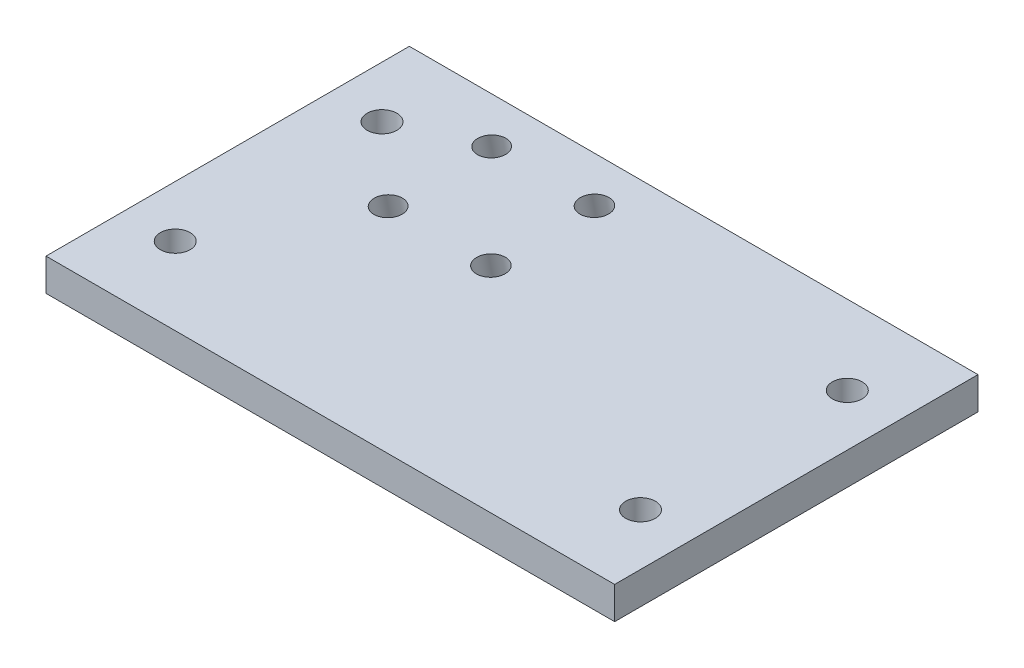
ISO-10303-21;
HEADER;
FILE_DESCRIPTION(('STEP AP214'),'2;1');
FILE_NAME('part.step','',(''),(''),'','','');
FILE_SCHEMA(('AUTOMOTIVE_DESIGN { 1 0 10303 214 1 1 1 1 }'));
ENDSEC;
DATA;
#1=APPLICATION_CONTEXT('core data for automotive mechanical design processes');
#2=APPLICATION_PROTOCOL_DEFINITION('international standard','automotive_design',2000,#1);
#3=PRODUCT_CONTEXT('',#1,'mechanical');
#4=PRODUCT('Part','Part','',(#3));
#5=PRODUCT_RELATED_PRODUCT_CATEGORY('part','',(#4));
#6=PRODUCT_DEFINITION_FORMATION('','',#4);
#7=PRODUCT_DEFINITION_CONTEXT('part definition',#1,'design');
#8=PRODUCT_DEFINITION('design','',#6,#7);
#9=PRODUCT_DEFINITION_SHAPE('','',#8);
#10=(LENGTH_UNIT() NAMED_UNIT(*) SI_UNIT(.MILLI.,.METRE.));
#11=(NAMED_UNIT(*) PLANE_ANGLE_UNIT() SI_UNIT($,.RADIAN.));
#12=(NAMED_UNIT(*) SI_UNIT($,.STERADIAN.) SOLID_ANGLE_UNIT());
#13=UNCERTAINTY_MEASURE_WITH_UNIT(LENGTH_MEASURE(1.E-05),#10,'distance_accuracy_value','');
#14=(GEOMETRIC_REPRESENTATION_CONTEXT(3) GLOBAL_UNCERTAINTY_ASSIGNED_CONTEXT((#13)) GLOBAL_UNIT_ASSIGNED_CONTEXT((#10,
#11,#12)) REPRESENTATION_CONTEXT('',''));
#15=CARTESIAN_POINT('',(0.,0.,0.));
#16=DIRECTION('',(0.,0.,1.));
#17=DIRECTION('',(1.,0.,0.));
#18=AXIS2_PLACEMENT_3D('',#15,#16,#17);
#19=CARTESIAN_POINT('',(0.,5.,0.));
#20=DIRECTION('',(0.,0.,-1.));
#21=DIRECTION('',(-1.,0.,0.));
#22=AXIS2_PLACEMENT_3D('',#19,#20,#21);
#23=PLANE('',#22);
#24=DIRECTION('',(1.,0.,0.));
#25=VECTOR('',#24,1.);
#26=CARTESIAN_POINT('',(0.,5.,0.));
#27=LINE('',#26,#25);
#28=CARTESIAN_POINT('',(2.,5.,0.));
#29=VERTEX_POINT('',#28);
#30=CARTESIAN_POINT('',(90.,5.,0.));
#31=VERTEX_POINT('',#30);
#32=EDGE_CURVE('E89',#29,#31,#27,.T.);
#33=ORIENTED_EDGE('',*,*,#32,.F.);
#34=DIRECTION('',(0.,-1.,0.));
#35=VECTOR('',#34,1.);
#36=CARTESIAN_POINT('',(2.,5.,0.));
#37=LINE('',#36,#35);
#38=CARTESIAN_POINT('',(2.,0.,0.));
#39=VERTEX_POINT('',#38);
#40=EDGE_CURVE('E137',#29,#39,#37,.T.);
#41=ORIENTED_EDGE('',*,*,#40,.T.);
#42=DIRECTION('',(1.,0.,0.));
#43=VECTOR('',#42,1.);
#44=CARTESIAN_POINT('',(0.,0.,0.));
#45=LINE('',#44,#43);
#46=CARTESIAN_POINT('',(90.,0.,0.));
#47=VERTEX_POINT('',#46);
#48=EDGE_CURVE('E79',#39,#47,#45,.T.);
#49=ORIENTED_EDGE('',*,*,#48,.T.);
#50=DIRECTION('',(0.,-1.,0.));
#51=VECTOR('',#50,1.);
#52=CARTESIAN_POINT('',(90.,5.,0.));
#53=LINE('',#52,#51);
#54=EDGE_CURVE('E11',#31,#47,#53,.T.);
#55=ORIENTED_EDGE('',*,*,#54,.F.);
#56=EDGE_LOOP('',(#33,#41,#49,#55));
#57=FACE_BOUND('',#56,.T.);
#58=ADVANCED_FACE('F33',(#57),#23,.F.);
#59=CARTESIAN_POINT('',(90.,5.,0.));
#60=DIRECTION('',(-1.,0.,0.));
#61=DIRECTION('',(0.,0.,1.));
#62=AXIS2_PLACEMENT_3D('',#59,#60,#61);
#63=PLANE('',#62);
#64=DIRECTION('',(0.,0.,-1.));
#65=VECTOR('',#64,1.);
#66=CARTESIAN_POINT('',(90.,0.,0.));
#67=LINE('',#66,#65);
#68=CARTESIAN_POINT('',(90.,0.,-56.23));
#69=VERTEX_POINT('',#68);
#70=EDGE_CURVE('E70',#47,#69,#67,.T.);
#71=ORIENTED_EDGE('',*,*,#70,.T.);
#72=DIRECTION('',(0.,-1.,0.));
#73=VECTOR('',#72,1.);
#74=CARTESIAN_POINT('',(90.,5.,-56.23));
#75=LINE('',#74,#73);
#76=CARTESIAN_POINT('',(90.,5.,-56.23));
#77=VERTEX_POINT('',#76);
#78=EDGE_CURVE('E41',#77,#69,#75,.T.);
#79=ORIENTED_EDGE('',*,*,#78,.F.);
#80=DIRECTION('',(0.,0.,-1.));
#81=VECTOR('',#80,1.);
#82=CARTESIAN_POINT('',(90.,5.,0.));
#83=LINE('',#82,#81);
#84=EDGE_CURVE('E58',#31,#77,#83,.T.);
#85=ORIENTED_EDGE('',*,*,#84,.F.);
#86=ORIENTED_EDGE('',*,*,#54,.T.);
#87=EDGE_LOOP('',(#71,#79,#85,#86));
#88=FACE_BOUND('',#87,.T.);
#89=ADVANCED_FACE('F72',(#88),#63,.F.);
#90=CARTESIAN_POINT('',(0.,5.,-56.23));
#91=DIRECTION('',(0.,0.,1.));
#92=DIRECTION('',(1.,0.,0.));
#93=AXIS2_PLACEMENT_3D('',#90,#91,#92);
#94=PLANE('',#93);
#95=DIRECTION('',(-1.,0.,0.));
#96=VECTOR('',#95,1.);
#97=CARTESIAN_POINT('',(0.,0.,-56.23));
#98=LINE('',#97,#96);
#99=CARTESIAN_POINT('',(1.99999999999999,0.,-56.23));
#100=VERTEX_POINT('',#99);
#101=EDGE_CURVE('E78',#69,#100,#98,.T.);
#102=ORIENTED_EDGE('',*,*,#101,.T.);
#103=DIRECTION('',(0.,-1.,0.));
#104=VECTOR('',#103,1.);
#105=CARTESIAN_POINT('',(1.99999999999997,0.,-56.23));
#106=LINE('',#105,#104);
#107=CARTESIAN_POINT('',(1.99999999999997,5.,-56.23));
#108=VERTEX_POINT('',#107);
#109=EDGE_CURVE('E49',#108,#100,#106,.T.);
#110=ORIENTED_EDGE('',*,*,#109,.F.);
#111=DIRECTION('',(-1.,0.,0.));
#112=VECTOR('',#111,1.);
#113=CARTESIAN_POINT('',(0.,5.,-56.23));
#114=LINE('',#113,#112);
#115=EDGE_CURVE('E84',#77,#108,#114,.T.);
#116=ORIENTED_EDGE('',*,*,#115,.F.);
#117=ORIENTED_EDGE('',*,*,#78,.T.);
#118=EDGE_LOOP('',(#102,#110,#116,#117));
#119=FACE_BOUND('',#118,.T.);
#120=ADVANCED_FACE('F83',(#119),#94,.F.);
#121=CARTESIAN_POINT('',(0.,5.,0.));
#122=DIRECTION('',(0.,-1.,0.));
#123=DIRECTION('',(0.,0.,-1.));
#124=AXIS2_PLACEMENT_3D('',#121,#122,#123);
#125=PLANE('',#124);
#126=CARTESIAN_POINT('',(21.7903171823512,5.,-33.1540398559662));
#127=DIRECTION('',(0.,-1.,0.));
#128=DIRECTION('',(0.,0.,1.));
#129=AXIS2_PLACEMENT_3D('',#126,#127,#128);
#130=ELLIPSE('',#129,2.2,2.15957980358486);
#131=CARTESIAN_POINT('',(21.7903171823512,5.,-30.9540398559662));
#132=VERTEX_POINT('',#131);
#133=EDGE_CURVE('E129',#132,#132,#130,.T.);
#134=ORIENTED_EDGE('',*,*,#133,.T.);
#135=EDGE_LOOP('',(#134));
#136=FACE_BOUND('',#135,.T.);
#137=CARTESIAN_POINT('',(37.700491287554,5.,-33.1540398559662));
#138=DIRECTION('',(0.,-1.,0.));
#139=DIRECTION('',(0.,0.,1.));
#140=AXIS2_PLACEMENT_3D('',#137,#138,#139);
#141=ELLIPSE('',#140,2.24132498514727,2.200145532361);
#142=CARTESIAN_POINT('',(37.700491287554,5.,-30.912714870819));
#143=VERTEX_POINT('',#142);
#144=EDGE_CURVE('E118',#143,#143,#141,.T.);
#145=ORIENTED_EDGE('',*,*,#144,.T.);
#146=EDGE_LOOP('',(#145));
#147=FACE_BOUND('',#146,.T.);
#148=CARTESIAN_POINT('',(37.700491287554,5.,-49.1767660082383));
#149=DIRECTION('',(0.,-1.,0.));
#150=DIRECTION('',(0.,0.,1.));
#151=AXIS2_PLACEMENT_3D('',#148,#149,#150);
#152=ELLIPSE('',#151,2.24117672890147,2.2);
#153=CARTESIAN_POINT('',(37.700491287554,5.,-46.9355892793368));
#154=VERTEX_POINT('',#153);
#155=EDGE_CURVE('E115',#154,#154,#152,.T.);
#156=ORIENTED_EDGE('',*,*,#155,.T.);
#157=EDGE_LOOP('',(#156));
#158=FACE_BOUND('',#157,.T.);
#159=CARTESIAN_POINT('',(21.7903171823512,5.,-49.1767660082383));
#160=DIRECTION('',(0.,-1.,0.));
#161=DIRECTION('',(0.,0.,1.));
#162=AXIS2_PLACEMENT_3D('',#159,#160,#161);
#163=ELLIPSE('',#162,2.2,2.15957980358486);
#164=CARTESIAN_POINT('',(21.7903171823512,5.,-46.9767660082383));
#165=VERTEX_POINT('',#164);
#166=EDGE_CURVE('E112',#165,#165,#163,.T.);
#167=ORIENTED_EDGE('',*,*,#166,.T.);
#168=EDGE_LOOP('',(#167));
#169=FACE_BOUND('',#168,.T.);
#170=CARTESIAN_POINT('',(82.0000000000024,5.,-44.0000000000011));
#171=DIRECTION('',(0.,1.,0.));
#172=DIRECTION('',(0.,0.,1.));
#173=AXIS2_PLACEMENT_3D('',#170,#171,#172);
#174=CIRCLE('',#173,2.29999999999999);
#175=CARTESIAN_POINT('',(82.0000000000024,5.,-41.7000000000011));
#176=VERTEX_POINT('',#175);
#177=EDGE_CURVE('E105',#176,#176,#174,.T.);
#178=ORIENTED_EDGE('',*,*,#177,.F.);
#179=EDGE_LOOP('',(#178));
#180=FACE_BOUND('',#179,.T.);
#181=CARTESIAN_POINT('',(10.0000000000024,5.,-44.0000000000013));
#182=DIRECTION('',(0.,1.,0.));
#183=DIRECTION('',(0.,0.,1.));
#184=AXIS2_PLACEMENT_3D('',#181,#182,#183);
#185=CIRCLE('',#184,2.3);
#186=CARTESIAN_POINT('',(10.0000000000024,5.,-41.7000000000013));
#187=VERTEX_POINT('',#186);
#188=EDGE_CURVE('E140',#187,#187,#185,.T.);
#189=ORIENTED_EDGE('',*,*,#188,.F.);
#190=EDGE_LOOP('',(#189));
#191=FACE_BOUND('',#190,.T.);
#192=CARTESIAN_POINT('',(82.0000000000023,5.,-12.0000000000011));
#193=DIRECTION('',(0.,1.,0.));
#194=DIRECTION('',(0.,0.,1.));
#195=AXIS2_PLACEMENT_3D('',#192,#193,#194);
#196=CIRCLE('',#195,2.29999999999999);
#197=CARTESIAN_POINT('',(82.0000000000023,5.,-9.70000000000109));
#198=VERTEX_POINT('',#197);
#199=EDGE_CURVE('E98',#198,#198,#196,.T.);
#200=ORIENTED_EDGE('',*,*,#199,.F.);
#201=EDGE_LOOP('',(#200));
#202=FACE_BOUND('',#201,.T.);
#203=CARTESIAN_POINT('',(10.0000000000023,5.,-12.0000000000013));
#204=DIRECTION('',(0.,1.,0.));
#205=DIRECTION('',(0.,0.,1.));
#206=AXIS2_PLACEMENT_3D('',#203,#204,#205);
#207=CIRCLE('',#206,2.3);
#208=CARTESIAN_POINT('',(10.0000000000023,5.,-9.70000000000134));
#209=VERTEX_POINT('',#208);
#210=EDGE_CURVE('E108',#209,#209,#207,.T.);
#211=ORIENTED_EDGE('',*,*,#210,.F.);
#212=EDGE_LOOP('',(#211));
#213=FACE_BOUND('',#212,.T.);
#214=ORIENTED_EDGE('',*,*,#115,.T.);
#215=DIRECTION('',(0.,0.,1.));
#216=VECTOR('',#215,1.);
#217=CARTESIAN_POINT('',(2.,5.,0.));
#218=LINE('',#217,#216);
#219=EDGE_CURVE('E134',#108,#29,#218,.T.);
#220=ORIENTED_EDGE('',*,*,#219,.T.);
#221=ORIENTED_EDGE('',*,*,#32,.T.);
#222=ORIENTED_EDGE('',*,*,#84,.T.);
#223=EDGE_LOOP('',(#214,#220,#221,#222));
#224=FACE_BOUND('',#223,.T.);
#225=ADVANCED_FACE('F158',(#136,#147,#158,#169,#180,#191,#202,#213,#224),#125,.F.);
#226=CARTESIAN_POINT('',(0.,0.,0.));
#227=DIRECTION('',(0.,-1.,0.));
#228=DIRECTION('',(0.,0.,-1.));
#229=AXIS2_PLACEMENT_3D('',#226,#227,#228);
#230=PLANE('',#229);
#231=CARTESIAN_POINT('',(21.7903171823512,0.,-34.1259414016548));
#232=DIRECTION('',(0.,-1.,0.));
#233=DIRECTION('',(0.,0.,1.));
#234=AXIS2_PLACEMENT_3D('',#231,#232,#233);
#235=ELLIPSE('',#234,2.2,2.15957980358486);
#236=CARTESIAN_POINT('',(21.7903171823512,0.,-31.9259414016548));
#237=VERTEX_POINT('',#236);
#238=EDGE_CURVE('E36',#237,#237,#235,.T.);
#239=ORIENTED_EDGE('',*,*,#238,.F.);
#240=EDGE_LOOP('',(#239));
#241=FACE_BOUND('',#240,.T.);
#242=CARTESIAN_POINT('',(37.700491287554,0.,-34.1259414016548));
#243=DIRECTION('',(0.,-1.,0.));
#244=DIRECTION('',(0.,0.,1.));
#245=AXIS2_PLACEMENT_3D('',#242,#243,#244);
#246=ELLIPSE('',#245,2.24132498514727,2.200145532361);
#247=CARTESIAN_POINT('',(37.700491287554,0.,-31.8846164165076));
#248=VERTEX_POINT('',#247);
#249=EDGE_CURVE('E116',#248,#248,#246,.T.);
#250=ORIENTED_EDGE('',*,*,#249,.F.);
#251=EDGE_LOOP('',(#250));
#252=FACE_BOUND('',#251,.T.);
#253=CARTESIAN_POINT('',(37.700491287554,0.,-50.1486675539269));
#254=DIRECTION('',(0.,-1.,0.));
#255=DIRECTION('',(0.,0.,1.));
#256=AXIS2_PLACEMENT_3D('',#253,#254,#255);
#257=ELLIPSE('',#256,2.24117672890147,2.2);
#258=CARTESIAN_POINT('',(37.700491287554,0.,-47.9074908250254));
#259=VERTEX_POINT('',#258);
#260=EDGE_CURVE('E113',#259,#259,#257,.T.);
#261=ORIENTED_EDGE('',*,*,#260,.F.);
#262=EDGE_LOOP('',(#261));
#263=FACE_BOUND('',#262,.T.);
#264=CARTESIAN_POINT('',(21.7903171823512,0.,-50.1486675539269));
#265=DIRECTION('',(0.,-1.,0.));
#266=DIRECTION('',(0.,0.,1.));
#267=AXIS2_PLACEMENT_3D('',#264,#265,#266);
#268=ELLIPSE('',#267,2.2,2.15957980358486);
#269=CARTESIAN_POINT('',(21.7903171823512,0.,-47.9486675539269));
#270=VERTEX_POINT('',#269);
#271=EDGE_CURVE('E109',#270,#270,#268,.T.);
#272=ORIENTED_EDGE('',*,*,#271,.F.);
#273=EDGE_LOOP('',(#272));
#274=FACE_BOUND('',#273,.T.);
#275=DIRECTION('',(0.,0.,1.));
#276=VECTOR('',#275,1.);
#277=CARTESIAN_POINT('',(1.99999999999997,0.,-56.23));
#278=LINE('',#277,#276);
#279=EDGE_CURVE('E88',#100,#39,#278,.T.);
#280=ORIENTED_EDGE('',*,*,#279,.F.);
#281=ORIENTED_EDGE('',*,*,#101,.F.);
#282=ORIENTED_EDGE('',*,*,#70,.F.);
#283=ORIENTED_EDGE('',*,*,#48,.F.);
#284=EDGE_LOOP('',(#280,#281,#282,#283));
#285=FACE_BOUND('',#284,.T.);
#286=CARTESIAN_POINT('',(82.0000000000024,0.,-44.0000000000011));
#287=DIRECTION('',(0.,-1.,0.));
#288=DIRECTION('',(0.,0.,-1.));
#289=AXIS2_PLACEMENT_3D('',#286,#287,#288);
#290=CIRCLE('',#289,2.29999999999999);
#291=CARTESIAN_POINT('',(82.0000000000024,0.,-41.7000000000011));
#292=VERTEX_POINT('',#291);
#293=EDGE_CURVE('E104',#292,#292,#290,.T.);
#294=ORIENTED_EDGE('',*,*,#293,.F.);
#295=EDGE_LOOP('',(#294));
#296=FACE_BOUND('',#295,.T.);
#297=CARTESIAN_POINT('',(10.0000000000024,0.,-44.0000000000013));
#298=DIRECTION('',(0.,-1.,0.));
#299=DIRECTION('',(0.,0.,-1.));
#300=AXIS2_PLACEMENT_3D('',#297,#298,#299);
#301=CIRCLE('',#300,2.3);
#302=CARTESIAN_POINT('',(10.0000000000024,0.,-41.7000000000013));
#303=VERTEX_POINT('',#302);
#304=EDGE_CURVE('E101',#303,#303,#301,.T.);
#305=ORIENTED_EDGE('',*,*,#304,.F.);
#306=EDGE_LOOP('',(#305));
#307=FACE_BOUND('',#306,.T.);
#308=CARTESIAN_POINT('',(82.0000000000023,0.,-12.0000000000011));
#309=DIRECTION('',(0.,-1.,0.));
#310=DIRECTION('',(0.,0.,-1.));
#311=AXIS2_PLACEMENT_3D('',#308,#309,#310);
#312=CIRCLE('',#311,2.29999999999999);
#313=CARTESIAN_POINT('',(82.0000000000023,0.,-9.70000000000109));
#314=VERTEX_POINT('',#313);
#315=EDGE_CURVE('E97',#314,#314,#312,.T.);
#316=ORIENTED_EDGE('',*,*,#315,.F.);
#317=EDGE_LOOP('',(#316));
#318=FACE_BOUND('',#317,.T.);
#319=CARTESIAN_POINT('',(10.0000000000023,0.,-12.0000000000013));
#320=DIRECTION('',(0.,-1.,0.));
#321=DIRECTION('',(0.,0.,-1.));
#322=AXIS2_PLACEMENT_3D('',#319,#320,#321);
#323=CIRCLE('',#322,2.3);
#324=CARTESIAN_POINT('',(10.0000000000023,0.,-9.70000000000134));
#325=VERTEX_POINT('',#324);
#326=EDGE_CURVE('E94',#325,#325,#323,.T.);
#327=ORIENTED_EDGE('',*,*,#326,.F.);
#328=EDGE_LOOP('',(#327));
#329=FACE_BOUND('',#328,.T.);
#330=ADVANCED_FACE('F86',(#241,#252,#263,#274,#285,#296,#307,#318,#329),#230,.T.);
#331=CARTESIAN_POINT('',(10.0000000000023,-10.,-12.0000000000013));
#332=DIRECTION('',(0.,1.,0.));
#333=DIRECTION('',(0.,0.,1.));
#334=AXIS2_PLACEMENT_3D('',#331,#332,#333);
#335=CYLINDRICAL_SURFACE('',#334,2.3);
#336=CARTESIAN_POINT('',(10.0000000000023,0.,-9.70000000000134));
#337=CARTESIAN_POINT('',(10.0000000000023,0.0520833333333351,-9.70000000000134));
#338=CARTESIAN_POINT('',(10.0000000000023,0.104166666666669,-9.70000000000134));
#339=CARTESIAN_POINT('',(10.0000000000023,0.208333333333335,-9.70000000000134));
#340=CARTESIAN_POINT('',(10.0000000000023,0.260416666666669,-9.70000000000134));
#341=CARTESIAN_POINT('',(10.0000000000023,0.364583333333335,-9.70000000000134));
#342=CARTESIAN_POINT('',(10.0000000000023,0.416666666666669,-9.70000000000134));
#343=CARTESIAN_POINT('',(10.0000000000023,0.520833333333335,-9.70000000000134));
#344=CARTESIAN_POINT('',(10.0000000000023,0.572916666666669,-9.70000000000134));
#345=CARTESIAN_POINT('',(10.0000000000023,0.677083333333335,-9.70000000000134));
#346=CARTESIAN_POINT('',(10.0000000000023,0.729166666666668,-9.70000000000134));
#347=CARTESIAN_POINT('',(10.0000000000023,0.833333333333334,-9.70000000000134));
#348=CARTESIAN_POINT('',(10.0000000000023,0.885416666666668,-9.70000000000134));
#349=CARTESIAN_POINT('',(10.0000000000023,0.989583333333334,-9.70000000000134));
#350=CARTESIAN_POINT('',(10.0000000000023,1.04166666666667,-9.70000000000134));
#351=CARTESIAN_POINT('',(10.0000000000023,1.14583333333333,-9.70000000000134));
#352=CARTESIAN_POINT('',(10.0000000000023,1.19791666666667,-9.70000000000134));
#353=CARTESIAN_POINT('',(10.0000000000023,1.30208333333333,-9.70000000000134));
#354=CARTESIAN_POINT('',(10.0000000000023,1.35416666666667,-9.70000000000134));
#355=CARTESIAN_POINT('',(10.0000000000023,1.45833333333333,-9.70000000000134));
#356=CARTESIAN_POINT('',(10.0000000000023,1.51041666666667,-9.70000000000134));
#357=CARTESIAN_POINT('',(10.0000000000023,1.61458333333333,-9.70000000000134));
#358=CARTESIAN_POINT('',(10.0000000000023,1.66666666666667,-9.70000000000134));
#359=CARTESIAN_POINT('',(10.0000000000023,1.77083333333333,-9.70000000000134));
#360=CARTESIAN_POINT('',(10.0000000000023,1.82291666666667,-9.70000000000134));
#361=CARTESIAN_POINT('',(10.0000000000023,1.92708333333333,-9.70000000000134));
#362=CARTESIAN_POINT('',(10.0000000000023,1.97916666666667,-9.70000000000134));
#363=CARTESIAN_POINT('',(10.0000000000023,2.08333333333333,-9.70000000000134));
#364=CARTESIAN_POINT('',(10.0000000000023,2.13541666666667,-9.70000000000134));
#365=CARTESIAN_POINT('',(10.0000000000023,2.23958333333333,-9.70000000000134));
#366=CARTESIAN_POINT('',(10.0000000000023,2.29166666666667,-9.70000000000134));
#367=CARTESIAN_POINT('',(10.0000000000023,2.39583333333333,-9.70000000000134));
#368=CARTESIAN_POINT('',(10.0000000000023,2.44791666666667,-9.70000000000134));
#369=CARTESIAN_POINT('',(10.0000000000023,2.55208333333333,-9.70000000000134));
#370=CARTESIAN_POINT('',(10.0000000000023,2.60416666666667,-9.70000000000134));
#371=CARTESIAN_POINT('',(10.0000000000023,2.70833333333333,-9.70000000000134));
#372=CARTESIAN_POINT('',(10.0000000000023,2.76041666666667,-9.70000000000134));
#373=CARTESIAN_POINT('',(10.0000000000023,2.86458333333333,-9.70000000000134));
#374=CARTESIAN_POINT('',(10.0000000000023,2.91666666666667,-9.70000000000134));
#375=CARTESIAN_POINT('',(10.0000000000023,3.02083333333333,-9.70000000000134));
#376=CARTESIAN_POINT('',(10.0000000000023,3.07291666666667,-9.70000000000134));
#377=CARTESIAN_POINT('',(10.0000000000023,3.17708333333333,-9.70000000000134));
#378=CARTESIAN_POINT('',(10.0000000000023,3.22916666666667,-9.70000000000134));
#379=CARTESIAN_POINT('',(10.0000000000023,3.33333333333333,-9.70000000000134));
#380=CARTESIAN_POINT('',(10.0000000000023,3.38541666666667,-9.70000000000134));
#381=CARTESIAN_POINT('',(10.0000000000023,3.48958333333333,-9.70000000000134));
#382=CARTESIAN_POINT('',(10.0000000000023,3.54166666666667,-9.70000000000134));
#383=CARTESIAN_POINT('',(10.0000000000023,3.64583333333333,-9.70000000000134));
#384=CARTESIAN_POINT('',(10.0000000000023,3.69791666666667,-9.70000000000134));
#385=CARTESIAN_POINT('',(10.0000000000023,3.80208333333333,-9.70000000000134));
#386=CARTESIAN_POINT('',(10.0000000000023,3.85416666666667,-9.70000000000134));
#387=CARTESIAN_POINT('',(10.0000000000023,3.95833333333333,-9.70000000000134));
#388=CARTESIAN_POINT('',(10.0000000000023,4.01041666666667,-9.70000000000134));
#389=CARTESIAN_POINT('',(10.0000000000023,4.11458333333333,-9.70000000000134));
#390=CARTESIAN_POINT('',(10.0000000000023,4.16666666666667,-9.70000000000134));
#391=CARTESIAN_POINT('',(10.0000000000023,4.27083333333333,-9.70000000000134));
#392=CARTESIAN_POINT('',(10.0000000000023,4.32291666666667,-9.70000000000134));
#393=CARTESIAN_POINT('',(10.0000000000023,4.42708333333333,-9.70000000000134));
#394=CARTESIAN_POINT('',(10.0000000000023,4.47916666666667,-9.70000000000134));
#395=CARTESIAN_POINT('',(10.0000000000023,4.58333333333333,-9.70000000000134));
#396=CARTESIAN_POINT('',(10.0000000000023,4.63541666666667,-9.70000000000134));
#397=CARTESIAN_POINT('',(10.0000000000023,4.73958333333333,-9.70000000000134));
#398=CARTESIAN_POINT('',(10.0000000000023,4.79166666666667,-9.70000000000134));
#399=CARTESIAN_POINT('',(10.0000000000023,4.89583333333333,-9.70000000000134));
#400=CARTESIAN_POINT('',(10.0000000000023,4.94791666666667,-9.70000000000134));
#401=CARTESIAN_POINT('',(10.0000000000023,5.,-9.70000000000134));
#402=B_SPLINE_CURVE_WITH_KNOTS('',3,(#336,#337,#338,#339,#340,#341,#342,#343,#344,#345,#346,
#347,#348,#349,#350,#351,#352,#353,#354,#355,#356,#357,#358,#359,#360,#361,#362,#363,#364,#365,
#366,#367,#368,#369,#370,#371,#372,#373,#374,#375,#376,#377,#378,#379,#380,#381,#382,#383,#384,
#385,#386,#387,#388,#389,#390,#391,#392,#393,#394,#395,#396,#397,#398,#399,#400,#401),
.UNSPECIFIED.,.F.,.F.,(4,2,2,2,2,2,2,2,2,2,2,2,2,2,2,2,2,2,2,2,2,2,2,2,2,2,2,2,2,2,2,2,4),(0.,
0.15625,0.3125,0.46875,0.625000000000001,0.781249999999999,0.937499999999999,1.09375,1.25,
1.40625,1.5625,1.71875,1.875,2.03125,2.1875,2.34375,2.5,2.65625,2.8125,2.96875,3.125,3.28125,
3.4375,3.59375,3.75,3.90625,4.0625,4.21875,4.375,4.53125,4.6875,4.84375,5.),.UNSPECIFIED.);
#403=EDGE_CURVE('BSEAM166',#325,#209,#402,.T.);
#404=ORIENTED_EDGE('',*,*,#326,.T.);
#405=ORIENTED_EDGE('',*,*,#210,.T.);
#406=ORIENTED_EDGE('',*,*,#403,.T.);
#407=ORIENTED_EDGE('',*,*,#403,.F.);
#408=EDGE_LOOP('',(#404,#406,#405,#407));
#409=FACE_BOUND('',#408,.T.);
#410=ADVANCED_FACE('F166',(#409),#335,.F.);
#411=CARTESIAN_POINT('',(82.0000000000023,-10.,-12.0000000000011));
#412=DIRECTION('',(0.,1.,0.));
#413=DIRECTION('',(0.,0.,1.));
#414=AXIS2_PLACEMENT_3D('',#411,#412,#413);
#415=CYLINDRICAL_SURFACE('',#414,2.29999999999999);
#416=CARTESIAN_POINT('',(82.0000000000023,0.,-9.70000000000109));
#417=CARTESIAN_POINT('',(82.0000000000023,0.0520833333333351,-9.70000000000109));
#418=CARTESIAN_POINT('',(82.0000000000023,0.104166666666669,-9.70000000000109));
#419=CARTESIAN_POINT('',(82.0000000000023,0.208333333333335,-9.70000000000109));
#420=CARTESIAN_POINT('',(82.0000000000023,0.260416666666669,-9.70000000000109));
#421=CARTESIAN_POINT('',(82.0000000000023,0.364583333333335,-9.70000000000109));
#422=CARTESIAN_POINT('',(82.0000000000023,0.416666666666669,-9.70000000000109));
#423=CARTESIAN_POINT('',(82.0000000000023,0.520833333333335,-9.70000000000109));
#424=CARTESIAN_POINT('',(82.0000000000023,0.572916666666669,-9.70000000000109));
#425=CARTESIAN_POINT('',(82.0000000000023,0.677083333333335,-9.70000000000109));
#426=CARTESIAN_POINT('',(82.0000000000023,0.729166666666668,-9.70000000000109));
#427=CARTESIAN_POINT('',(82.0000000000023,0.833333333333334,-9.70000000000109));
#428=CARTESIAN_POINT('',(82.0000000000023,0.885416666666668,-9.70000000000109));
#429=CARTESIAN_POINT('',(82.0000000000023,0.989583333333334,-9.70000000000109));
#430=CARTESIAN_POINT('',(82.0000000000023,1.04166666666667,-9.70000000000109));
#431=CARTESIAN_POINT('',(82.0000000000023,1.14583333333333,-9.70000000000109));
#432=CARTESIAN_POINT('',(82.0000000000023,1.19791666666667,-9.70000000000109));
#433=CARTESIAN_POINT('',(82.0000000000023,1.30208333333333,-9.70000000000109));
#434=CARTESIAN_POINT('',(82.0000000000023,1.35416666666667,-9.70000000000109));
#435=CARTESIAN_POINT('',(82.0000000000023,1.45833333333333,-9.70000000000109));
#436=CARTESIAN_POINT('',(82.0000000000023,1.51041666666667,-9.70000000000109));
#437=CARTESIAN_POINT('',(82.0000000000023,1.61458333333333,-9.70000000000109));
#438=CARTESIAN_POINT('',(82.0000000000023,1.66666666666667,-9.70000000000109));
#439=CARTESIAN_POINT('',(82.0000000000023,1.77083333333333,-9.70000000000109));
#440=CARTESIAN_POINT('',(82.0000000000023,1.82291666666667,-9.70000000000109));
#441=CARTESIAN_POINT('',(82.0000000000023,1.92708333333333,-9.70000000000109));
#442=CARTESIAN_POINT('',(82.0000000000023,1.97916666666667,-9.70000000000109));
#443=CARTESIAN_POINT('',(82.0000000000023,2.08333333333333,-9.70000000000109));
#444=CARTESIAN_POINT('',(82.0000000000023,2.13541666666667,-9.70000000000109));
#445=CARTESIAN_POINT('',(82.0000000000023,2.23958333333333,-9.70000000000109));
#446=CARTESIAN_POINT('',(82.0000000000023,2.29166666666667,-9.70000000000109));
#447=CARTESIAN_POINT('',(82.0000000000023,2.39583333333333,-9.70000000000109));
#448=CARTESIAN_POINT('',(82.0000000000023,2.44791666666667,-9.70000000000109));
#449=CARTESIAN_POINT('',(82.0000000000023,2.55208333333333,-9.70000000000109));
#450=CARTESIAN_POINT('',(82.0000000000023,2.60416666666667,-9.70000000000109));
#451=CARTESIAN_POINT('',(82.0000000000023,2.70833333333333,-9.70000000000109));
#452=CARTESIAN_POINT('',(82.0000000000023,2.76041666666667,-9.70000000000109));
#453=CARTESIAN_POINT('',(82.0000000000023,2.86458333333333,-9.70000000000109));
#454=CARTESIAN_POINT('',(82.0000000000023,2.91666666666667,-9.70000000000109));
#455=CARTESIAN_POINT('',(82.0000000000023,3.02083333333333,-9.70000000000109));
#456=CARTESIAN_POINT('',(82.0000000000023,3.07291666666667,-9.70000000000109));
#457=CARTESIAN_POINT('',(82.0000000000023,3.17708333333333,-9.70000000000109));
#458=CARTESIAN_POINT('',(82.0000000000023,3.22916666666667,-9.70000000000109));
#459=CARTESIAN_POINT('',(82.0000000000023,3.33333333333333,-9.70000000000109));
#460=CARTESIAN_POINT('',(82.0000000000023,3.38541666666667,-9.70000000000109));
#461=CARTESIAN_POINT('',(82.0000000000023,3.48958333333333,-9.70000000000109));
#462=CARTESIAN_POINT('',(82.0000000000023,3.54166666666667,-9.70000000000109));
#463=CARTESIAN_POINT('',(82.0000000000023,3.64583333333333,-9.70000000000109));
#464=CARTESIAN_POINT('',(82.0000000000023,3.69791666666667,-9.70000000000109));
#465=CARTESIAN_POINT('',(82.0000000000023,3.80208333333333,-9.70000000000109));
#466=CARTESIAN_POINT('',(82.0000000000023,3.85416666666667,-9.70000000000109));
#467=CARTESIAN_POINT('',(82.0000000000023,3.95833333333333,-9.70000000000109));
#468=CARTESIAN_POINT('',(82.0000000000023,4.01041666666667,-9.70000000000109));
#469=CARTESIAN_POINT('',(82.0000000000023,4.11458333333333,-9.70000000000109));
#470=CARTESIAN_POINT('',(82.0000000000023,4.16666666666667,-9.70000000000109));
#471=CARTESIAN_POINT('',(82.0000000000023,4.27083333333333,-9.70000000000109));
#472=CARTESIAN_POINT('',(82.0000000000023,4.32291666666667,-9.70000000000109));
#473=CARTESIAN_POINT('',(82.0000000000023,4.42708333333333,-9.70000000000109));
#474=CARTESIAN_POINT('',(82.0000000000023,4.47916666666667,-9.70000000000109));
#475=CARTESIAN_POINT('',(82.0000000000023,4.58333333333333,-9.70000000000109));
#476=CARTESIAN_POINT('',(82.0000000000023,4.63541666666667,-9.70000000000109));
#477=CARTESIAN_POINT('',(82.0000000000023,4.73958333333333,-9.70000000000109));
#478=CARTESIAN_POINT('',(82.0000000000023,4.79166666666667,-9.70000000000109));
#479=CARTESIAN_POINT('',(82.0000000000023,4.89583333333333,-9.70000000000109));
#480=CARTESIAN_POINT('',(82.0000000000023,4.94791666666667,-9.70000000000109));
#481=CARTESIAN_POINT('',(82.0000000000023,5.,-9.70000000000109));
#482=B_SPLINE_CURVE_WITH_KNOTS('',3,(#416,#417,#418,#419,#420,#421,#422,#423,#424,#425,#426,
#427,#428,#429,#430,#431,#432,#433,#434,#435,#436,#437,#438,#439,#440,#441,#442,#443,#444,#445,
#446,#447,#448,#449,#450,#451,#452,#453,#454,#455,#456,#457,#458,#459,#460,#461,#462,#463,#464,
#465,#466,#467,#468,#469,#470,#471,#472,#473,#474,#475,#476,#477,#478,#479,#480,#481),
.UNSPECIFIED.,.F.,.F.,(4,2,2,2,2,2,2,2,2,2,2,2,2,2,2,2,2,2,2,2,2,2,2,2,2,2,2,2,2,2,2,2,4),(0.,
0.15625,0.3125,0.46875,0.625000000000001,0.781249999999999,0.937499999999999,1.09375,1.25,
1.40625,1.5625,1.71875,1.875,2.03125,2.1875,2.34375,2.5,2.65625,2.8125,2.96875,3.125,3.28125,
3.4375,3.59375,3.75,3.90625,4.0625,4.21875,4.375,4.53125,4.6875,4.84375,5.),.UNSPECIFIED.);
#483=EDGE_CURVE('BSEAM206',#314,#198,#482,.T.);
#484=ORIENTED_EDGE('',*,*,#315,.T.);
#485=ORIENTED_EDGE('',*,*,#199,.T.);
#486=ORIENTED_EDGE('',*,*,#483,.T.);
#487=ORIENTED_EDGE('',*,*,#483,.F.);
#488=EDGE_LOOP('',(#484,#486,#485,#487));
#489=FACE_BOUND('',#488,.T.);
#490=ADVANCED_FACE('F206',(#489),#415,.F.);
#491=CARTESIAN_POINT('',(10.0000000000024,-40.,-44.0000000000013));
#492=DIRECTION('',(0.,1.,0.));
#493=DIRECTION('',(0.,0.,1.));
#494=AXIS2_PLACEMENT_3D('',#491,#492,#493);
#495=CYLINDRICAL_SURFACE('',#494,2.3);
#496=CARTESIAN_POINT('',(10.0000000000024,0.,-41.7000000000013));
#497=CARTESIAN_POINT('',(10.0000000000024,0.0520833333333392,-41.7000000000013));
#498=CARTESIAN_POINT('',(10.0000000000024,0.104166666666671,-41.7000000000013));
#499=CARTESIAN_POINT('',(10.0000000000024,0.208333333333338,-41.7000000000013));
#500=CARTESIAN_POINT('',(10.0000000000024,0.260416666666673,-41.7000000000013));
#501=CARTESIAN_POINT('',(10.0000000000024,0.364583333333339,-41.7000000000013));
#502=CARTESIAN_POINT('',(10.0000000000024,0.416666666666672,-41.7000000000013));
#503=CARTESIAN_POINT('',(10.0000000000024,0.520833333333338,-41.7000000000013));
#504=CARTESIAN_POINT('',(10.0000000000024,0.572916666666673,-41.7000000000013));
#505=CARTESIAN_POINT('',(10.0000000000024,0.67708333333334,-41.7000000000013));
#506=CARTESIAN_POINT('',(10.0000000000024,0.729166666666672,-41.7000000000013));
#507=CARTESIAN_POINT('',(10.0000000000024,0.833333333333339,-41.7000000000013));
#508=CARTESIAN_POINT('',(10.0000000000024,0.885416666666673,-41.7000000000013));
#509=CARTESIAN_POINT('',(10.0000000000024,0.98958333333334,-41.7000000000013));
#510=CARTESIAN_POINT('',(10.0000000000024,1.04166666666667,-41.7000000000013));
#511=CARTESIAN_POINT('',(10.0000000000024,1.14583333333334,-41.7000000000013));
#512=CARTESIAN_POINT('',(10.0000000000024,1.19791666666667,-41.7000000000013));
#513=CARTESIAN_POINT('',(10.0000000000024,1.30208333333334,-41.7000000000013));
#514=CARTESIAN_POINT('',(10.0000000000024,1.35416666666667,-41.7000000000013));
#515=CARTESIAN_POINT('',(10.0000000000024,1.45833333333334,-41.7000000000013));
#516=CARTESIAN_POINT('',(10.0000000000024,1.51041666666667,-41.7000000000013));
#517=CARTESIAN_POINT('',(10.0000000000024,1.61458333333334,-41.7000000000013));
#518=CARTESIAN_POINT('',(10.0000000000024,1.66666666666667,-41.7000000000013));
#519=CARTESIAN_POINT('',(10.0000000000024,1.77083333333334,-41.7000000000013));
#520=CARTESIAN_POINT('',(10.0000000000024,1.82291666666667,-41.7000000000013));
#521=CARTESIAN_POINT('',(10.0000000000024,1.92708333333334,-41.7000000000013));
#522=CARTESIAN_POINT('',(10.0000000000024,1.97916666666667,-41.7000000000013));
#523=CARTESIAN_POINT('',(10.0000000000024,2.08333333333334,-41.7000000000013));
#524=CARTESIAN_POINT('',(10.0000000000024,2.13541666666667,-41.7000000000013));
#525=CARTESIAN_POINT('',(10.0000000000024,2.23958333333334,-41.7000000000013));
#526=CARTESIAN_POINT('',(10.0000000000024,2.29166666666667,-41.7000000000013));
#527=CARTESIAN_POINT('',(10.0000000000024,2.39583333333334,-41.7000000000013));
#528=CARTESIAN_POINT('',(10.0000000000024,2.44791666666667,-41.7000000000013));
#529=CARTESIAN_POINT('',(10.0000000000024,2.55208333333333,-41.7000000000013));
#530=CARTESIAN_POINT('',(10.0000000000024,2.60416666666667,-41.7000000000013));
#531=CARTESIAN_POINT('',(10.0000000000024,2.70833333333333,-41.7000000000013));
#532=CARTESIAN_POINT('',(10.0000000000024,2.76041666666667,-41.7000000000013));
#533=CARTESIAN_POINT('',(10.0000000000024,2.86458333333333,-41.7000000000013));
#534=CARTESIAN_POINT('',(10.0000000000024,2.91666666666667,-41.7000000000013));
#535=CARTESIAN_POINT('',(10.0000000000024,3.02083333333333,-41.7000000000013));
#536=CARTESIAN_POINT('',(10.0000000000024,3.07291666666667,-41.7000000000013));
#537=CARTESIAN_POINT('',(10.0000000000024,3.17708333333334,-41.7000000000013));
#538=CARTESIAN_POINT('',(10.0000000000024,3.22916666666667,-41.7000000000013));
#539=CARTESIAN_POINT('',(10.0000000000024,3.33333333333333,-41.7000000000013));
#540=CARTESIAN_POINT('',(10.0000000000024,3.38541666666667,-41.7000000000013));
#541=CARTESIAN_POINT('',(10.0000000000024,3.48958333333334,-41.7000000000013));
#542=CARTESIAN_POINT('',(10.0000000000024,3.54166666666667,-41.7000000000013));
#543=CARTESIAN_POINT('',(10.0000000000024,3.64583333333333,-41.7000000000013));
#544=CARTESIAN_POINT('',(10.0000000000024,3.69791666666666,-41.7000000000013));
#545=CARTESIAN_POINT('',(10.0000000000024,3.80208333333333,-41.7000000000013));
#546=CARTESIAN_POINT('',(10.0000000000024,3.85416666666667,-41.7000000000013));
#547=CARTESIAN_POINT('',(10.0000000000024,3.95833333333333,-41.7000000000013));
#548=CARTESIAN_POINT('',(10.0000000000024,4.01041666666666,-41.7000000000013));
#549=CARTESIAN_POINT('',(10.0000000000024,4.11458333333333,-41.7000000000013));
#550=CARTESIAN_POINT('',(10.0000000000024,4.16666666666667,-41.7000000000013));
#551=CARTESIAN_POINT('',(10.0000000000024,4.27083333333333,-41.7000000000013));
#552=CARTESIAN_POINT('',(10.0000000000024,4.32291666666667,-41.7000000000013));
#553=CARTESIAN_POINT('',(10.0000000000024,4.42708333333333,-41.7000000000013));
#554=CARTESIAN_POINT('',(10.0000000000024,4.47916666666667,-41.7000000000013));
#555=CARTESIAN_POINT('',(10.0000000000024,4.58333333333333,-41.7000000000013));
#556=CARTESIAN_POINT('',(10.0000000000024,4.63541666666667,-41.7000000000013));
#557=CARTESIAN_POINT('',(10.0000000000024,4.73958333333333,-41.7000000000013));
#558=CARTESIAN_POINT('',(10.0000000000024,4.79166666666667,-41.7000000000013));
#559=CARTESIAN_POINT('',(10.0000000000024,4.89583333333333,-41.7000000000013));
#560=CARTESIAN_POINT('',(10.0000000000024,4.94791666666667,-41.7000000000013));
#561=CARTESIAN_POINT('',(10.0000000000024,5.,-41.7000000000013));
#562=B_SPLINE_CURVE_WITH_KNOTS('',3,(#496,#497,#498,#499,#500,#501,#502,#503,#504,#505,#506,
#507,#508,#509,#510,#511,#512,#513,#514,#515,#516,#517,#518,#519,#520,#521,#522,#523,#524,#525,
#526,#527,#528,#529,#530,#531,#532,#533,#534,#535,#536,#537,#538,#539,#540,#541,#542,#543,#544,
#545,#546,#547,#548,#549,#550,#551,#552,#553,#554,#555,#556,#557,#558,#559,#560,#561),
.UNSPECIFIED.,.F.,.F.,(4,2,2,2,2,2,2,2,2,2,2,2,2,2,2,2,2,2,2,2,2,2,2,2,2,2,2,2,2,2,2,2,4),(0.,
0.156249999999997,0.3125,0.468749999999997,0.625000000000001,0.781249999999997,
0.937500000000001,1.09375,1.25,1.40625,1.56249999999999,1.71875,1.87499999999999,2.03125,2.1875,
2.34375,2.5,2.65624999999999,2.8125,2.96874999999999,3.125,3.28124999999999,3.4375,
3.59374999999999,3.74999999999999,3.90624999999999,4.06249999999999,4.21874999999999,
4.37499999999999,4.53124999999999,4.68749999999999,4.84374999999999,4.99999999999999),.UNSPECIFIED.);
#563=EDGE_CURVE('BSEAM212',#303,#187,#562,.T.);
#564=ORIENTED_EDGE('',*,*,#304,.T.);
#565=ORIENTED_EDGE('',*,*,#188,.T.);
#566=ORIENTED_EDGE('',*,*,#563,.T.);
#567=ORIENTED_EDGE('',*,*,#563,.F.);
#568=EDGE_LOOP('',(#564,#566,#565,#567));
#569=FACE_BOUND('',#568,.T.);
#570=ADVANCED_FACE('F212',(#569),#495,.F.);
#571=CARTESIAN_POINT('',(82.0000000000024,-40.,-44.0000000000011));
#572=DIRECTION('',(0.,1.,0.));
#573=DIRECTION('',(0.,0.,1.));
#574=AXIS2_PLACEMENT_3D('',#571,#572,#573);
#575=CYLINDRICAL_SURFACE('',#574,2.29999999999999);
#576=CARTESIAN_POINT('',(82.0000000000024,0.,-41.7000000000011));
#577=CARTESIAN_POINT('',(82.0000000000024,0.0520833333333392,-41.7000000000011));
#578=CARTESIAN_POINT('',(82.0000000000024,0.104166666666671,-41.7000000000011));
#579=CARTESIAN_POINT('',(82.0000000000024,0.208333333333338,-41.7000000000011));
#580=CARTESIAN_POINT('',(82.0000000000024,0.260416666666673,-41.7000000000011));
#581=CARTESIAN_POINT('',(82.0000000000024,0.364583333333339,-41.7000000000011));
#582=CARTESIAN_POINT('',(82.0000000000024,0.416666666666672,-41.7000000000011));
#583=CARTESIAN_POINT('',(82.0000000000024,0.520833333333338,-41.7000000000011));
#584=CARTESIAN_POINT('',(82.0000000000024,0.572916666666673,-41.7000000000011));
#585=CARTESIAN_POINT('',(82.0000000000024,0.67708333333334,-41.7000000000011));
#586=CARTESIAN_POINT('',(82.0000000000024,0.729166666666672,-41.7000000000011));
#587=CARTESIAN_POINT('',(82.0000000000024,0.833333333333339,-41.7000000000011));
#588=CARTESIAN_POINT('',(82.0000000000024,0.885416666666673,-41.7000000000011));
#589=CARTESIAN_POINT('',(82.0000000000024,0.98958333333334,-41.7000000000011));
#590=CARTESIAN_POINT('',(82.0000000000024,1.04166666666667,-41.7000000000011));
#591=CARTESIAN_POINT('',(82.0000000000024,1.14583333333334,-41.7000000000011));
#592=CARTESIAN_POINT('',(82.0000000000024,1.19791666666667,-41.7000000000011));
#593=CARTESIAN_POINT('',(82.0000000000024,1.30208333333334,-41.7000000000011));
#594=CARTESIAN_POINT('',(82.0000000000024,1.35416666666667,-41.7000000000011));
#595=CARTESIAN_POINT('',(82.0000000000024,1.45833333333334,-41.7000000000011));
#596=CARTESIAN_POINT('',(82.0000000000024,1.51041666666667,-41.7000000000011));
#597=CARTESIAN_POINT('',(82.0000000000024,1.61458333333334,-41.7000000000011));
#598=CARTESIAN_POINT('',(82.0000000000024,1.66666666666667,-41.7000000000011));
#599=CARTESIAN_POINT('',(82.0000000000024,1.77083333333334,-41.7000000000011));
#600=CARTESIAN_POINT('',(82.0000000000024,1.82291666666667,-41.7000000000011));
#601=CARTESIAN_POINT('',(82.0000000000024,1.92708333333334,-41.7000000000011));
#602=CARTESIAN_POINT('',(82.0000000000024,1.97916666666667,-41.7000000000011));
#603=CARTESIAN_POINT('',(82.0000000000024,2.08333333333334,-41.7000000000011));
#604=CARTESIAN_POINT('',(82.0000000000024,2.13541666666667,-41.7000000000011));
#605=CARTESIAN_POINT('',(82.0000000000024,2.23958333333334,-41.7000000000011));
#606=CARTESIAN_POINT('',(82.0000000000024,2.29166666666667,-41.7000000000011));
#607=CARTESIAN_POINT('',(82.0000000000024,2.39583333333334,-41.7000000000011));
#608=CARTESIAN_POINT('',(82.0000000000024,2.44791666666667,-41.7000000000011));
#609=CARTESIAN_POINT('',(82.0000000000024,2.55208333333333,-41.7000000000011));
#610=CARTESIAN_POINT('',(82.0000000000024,2.60416666666667,-41.7000000000011));
#611=CARTESIAN_POINT('',(82.0000000000024,2.70833333333333,-41.7000000000011));
#612=CARTESIAN_POINT('',(82.0000000000024,2.76041666666667,-41.7000000000011));
#613=CARTESIAN_POINT('',(82.0000000000024,2.86458333333333,-41.7000000000011));
#614=CARTESIAN_POINT('',(82.0000000000024,2.91666666666667,-41.7000000000011));
#615=CARTESIAN_POINT('',(82.0000000000024,3.02083333333333,-41.7000000000011));
#616=CARTESIAN_POINT('',(82.0000000000024,3.07291666666667,-41.7000000000011));
#617=CARTESIAN_POINT('',(82.0000000000024,3.17708333333334,-41.7000000000011));
#618=CARTESIAN_POINT('',(82.0000000000024,3.22916666666667,-41.7000000000011));
#619=CARTESIAN_POINT('',(82.0000000000024,3.33333333333333,-41.7000000000011));
#620=CARTESIAN_POINT('',(82.0000000000024,3.38541666666667,-41.7000000000011));
#621=CARTESIAN_POINT('',(82.0000000000024,3.48958333333334,-41.7000000000011));
#622=CARTESIAN_POINT('',(82.0000000000024,3.54166666666667,-41.7000000000011));
#623=CARTESIAN_POINT('',(82.0000000000024,3.64583333333333,-41.7000000000011));
#624=CARTESIAN_POINT('',(82.0000000000024,3.69791666666666,-41.7000000000011));
#625=CARTESIAN_POINT('',(82.0000000000024,3.80208333333333,-41.7000000000011));
#626=CARTESIAN_POINT('',(82.0000000000024,3.85416666666667,-41.7000000000011));
#627=CARTESIAN_POINT('',(82.0000000000024,3.95833333333333,-41.7000000000011));
#628=CARTESIAN_POINT('',(82.0000000000024,4.01041666666666,-41.7000000000011));
#629=CARTESIAN_POINT('',(82.0000000000024,4.11458333333333,-41.7000000000011));
#630=CARTESIAN_POINT('',(82.0000000000024,4.16666666666667,-41.7000000000011));
#631=CARTESIAN_POINT('',(82.0000000000024,4.27083333333333,-41.7000000000011));
#632=CARTESIAN_POINT('',(82.0000000000024,4.32291666666667,-41.7000000000011));
#633=CARTESIAN_POINT('',(82.0000000000024,4.42708333333333,-41.7000000000011));
#634=CARTESIAN_POINT('',(82.0000000000024,4.47916666666667,-41.7000000000011));
#635=CARTESIAN_POINT('',(82.0000000000024,4.58333333333333,-41.7000000000011));
#636=CARTESIAN_POINT('',(82.0000000000024,4.63541666666667,-41.7000000000011));
#637=CARTESIAN_POINT('',(82.0000000000024,4.73958333333333,-41.7000000000011));
#638=CARTESIAN_POINT('',(82.0000000000024,4.79166666666667,-41.7000000000011));
#639=CARTESIAN_POINT('',(82.0000000000024,4.89583333333333,-41.7000000000011));
#640=CARTESIAN_POINT('',(82.0000000000024,4.94791666666667,-41.7000000000011));
#641=CARTESIAN_POINT('',(82.0000000000024,5.,-41.7000000000011));
#642=B_SPLINE_CURVE_WITH_KNOTS('',3,(#576,#577,#578,#579,#580,#581,#582,#583,#584,#585,#586,
#587,#588,#589,#590,#591,#592,#593,#594,#595,#596,#597,#598,#599,#600,#601,#602,#603,#604,#605,
#606,#607,#608,#609,#610,#611,#612,#613,#614,#615,#616,#617,#618,#619,#620,#621,#622,#623,#624,
#625,#626,#627,#628,#629,#630,#631,#632,#633,#634,#635,#636,#637,#638,#639,#640,#641),
.UNSPECIFIED.,.F.,.F.,(4,2,2,2,2,2,2,2,2,2,2,2,2,2,2,2,2,2,2,2,2,2,2,2,2,2,2,2,2,2,2,2,4),(0.,
0.156249999999997,0.3125,0.468749999999997,0.625000000000001,0.781249999999997,
0.937500000000001,1.09375,1.25,1.40625,1.56249999999999,1.71875,1.87499999999999,2.03125,2.1875,
2.34375,2.5,2.65624999999999,2.8125,2.96874999999999,3.125,3.28124999999999,3.4375,
3.59374999999999,3.74999999999999,3.90624999999999,4.06249999999999,4.21874999999999,
4.37499999999999,4.53124999999999,4.68749999999999,4.84374999999999,4.99999999999999),.UNSPECIFIED.);
#643=EDGE_CURVE('BSEAM220',#292,#176,#642,.T.);
#644=ORIENTED_EDGE('',*,*,#293,.T.);
#645=ORIENTED_EDGE('',*,*,#177,.T.);
#646=ORIENTED_EDGE('',*,*,#643,.T.);
#647=ORIENTED_EDGE('',*,*,#643,.F.);
#648=EDGE_LOOP('',(#644,#646,#645,#647));
#649=FACE_BOUND('',#648,.T.);
#650=ADVANCED_FACE('F220',(#649),#575,.F.);
#651=CARTESIAN_POINT('',(2.,0.,0.));
#652=DIRECTION('',(1.,0.,0.));
#653=DIRECTION('',(0.,0.,-1.));
#654=AXIS2_PLACEMENT_3D('',#651,#652,#653);
#655=PLANE('',#654);
#656=ORIENTED_EDGE('',*,*,#219,.F.);
#657=ORIENTED_EDGE('',*,*,#109,.T.);
#658=ORIENTED_EDGE('',*,*,#279,.T.);
#659=ORIENTED_EDGE('',*,*,#40,.F.);
#660=EDGE_LOOP('',(#656,#657,#658,#659));
#661=FACE_BOUND('',#660,.T.);
#662=ADVANCED_FACE('F157',(#661),#655,.F.);
#663=CARTESIAN_POINT('',(21.7903171823512,-5.42157327417447,-51.2025146429737));
#664=DIRECTION('',(0.,0.981627183447664,0.190808995376545));
#665=DIRECTION('',(0.,-0.190808995376545,0.981627183447664));
#666=AXIS2_PLACEMENT_3D('',#663,#664,#665);
#667=CYLINDRICAL_SURFACE('',#666,2.15957980358486);
#668=ORIENTED_EDGE('',*,*,#271,.T.);
#669=EDGE_LOOP('',(#668));
#670=FACE_BOUND('',#669,.T.);
#671=ORIENTED_EDGE('',*,*,#166,.F.);
#672=EDGE_LOOP('',(#671));
#673=FACE_BOUND('',#672,.T.);
#674=ADVANCED_FACE('F233',(#670,#673),#667,.F.);
#675=CARTESIAN_POINT('',(37.700491287554,-5.42157327417447,-51.2025146429737));
#676=DIRECTION('',(0.,0.981627183447664,0.190808995376545));
#677=DIRECTION('',(0.,-0.190808995376545,0.981627183447664));
#678=AXIS2_PLACEMENT_3D('',#675,#676,#677);
#679=CYLINDRICAL_SURFACE('',#678,2.2);
#680=ORIENTED_EDGE('',*,*,#260,.T.);
#681=EDGE_LOOP('',(#680));
#682=FACE_BOUND('',#681,.T.);
#683=ORIENTED_EDGE('',*,*,#155,.F.);
#684=EDGE_LOOP('',(#683));
#685=FACE_BOUND('',#684,.T.);
#686=ADVANCED_FACE('F239',(#682,#685),#679,.F.);
#687=CARTESIAN_POINT('',(37.700491287554,-8.42268270474382,-35.7631450695718));
#688=DIRECTION('',(0.,0.981627183447664,0.190808995376545));
#689=DIRECTION('',(0.,-0.190808995376545,0.981627183447664));
#690=AXIS2_PLACEMENT_3D('',#687,#688,#689);
#691=CYLINDRICAL_SURFACE('',#690,2.200145532361);
#692=ORIENTED_EDGE('',*,*,#249,.T.);
#693=EDGE_LOOP('',(#692));
#694=FACE_BOUND('',#693,.T.);
#695=ORIENTED_EDGE('',*,*,#144,.F.);
#696=EDGE_LOOP('',(#695));
#697=FACE_BOUND('',#696,.T.);
#698=ADVANCED_FACE('F247',(#694,#697),#691,.F.);
#699=CARTESIAN_POINT('',(21.7903171823512,-8.42268270474382,-35.7631450695718));
#700=DIRECTION('',(0.,0.981627183447664,0.190808995376545));
#701=DIRECTION('',(0.,-0.190808995376545,0.981627183447664));
#702=AXIS2_PLACEMENT_3D('',#699,#700,#701);
#703=CYLINDRICAL_SURFACE('',#702,2.15957980358486);
#704=ORIENTED_EDGE('',*,*,#238,.T.);
#705=EDGE_LOOP('',(#704));
#706=FACE_BOUND('',#705,.T.);
#707=ORIENTED_EDGE('',*,*,#133,.F.);
#708=EDGE_LOOP('',(#707));
#709=FACE_BOUND('',#708,.T.);
#710=ADVANCED_FACE('F255',(#706,#709),#703,.F.);
#711=CLOSED_SHELL('',(#58,#89,#120,#225,#330,#410,#490,#570,#650,#662,#674,#686,#698,#710));
#712=MANIFOLD_SOLID_BREP('B2',#711);
#713=ADVANCED_BREP_SHAPE_REPRESENTATION('',(#18,#712),#14);
#714=SHAPE_DEFINITION_REPRESENTATION(#9,#713);
ENDSEC;
END-ISO-10303-21;
